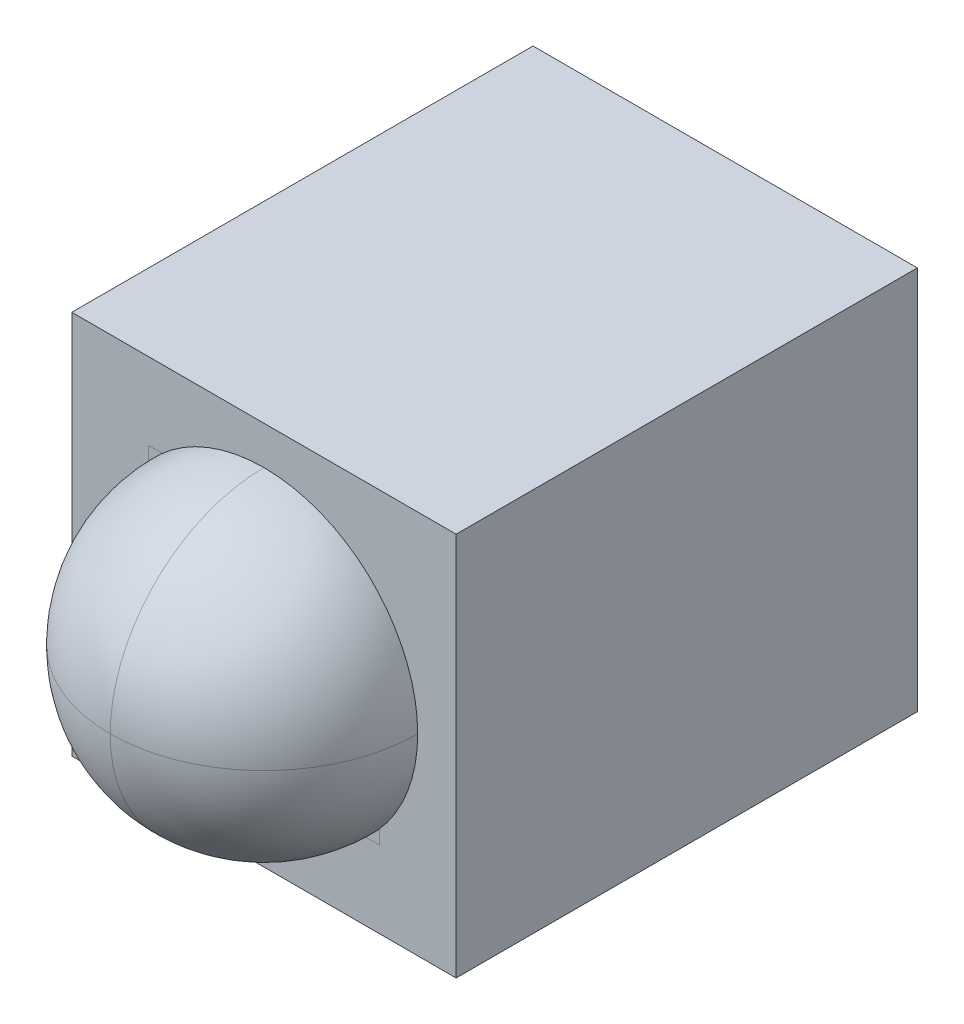
ISO-10303-21;
HEADER;
FILE_DESCRIPTION(('STEP AP214'),'2;1');
FILE_NAME('part.step','',(''),(''),'','','');
FILE_SCHEMA(('AUTOMOTIVE_DESIGN { 1 0 10303 214 1 1 1 1 }'));
ENDSEC;
DATA;
#1=APPLICATION_CONTEXT('core data for automotive mechanical design processes');
#2=APPLICATION_PROTOCOL_DEFINITION('international standard','automotive_design',2000,#1);
#3=PRODUCT_CONTEXT('',#1,'mechanical');
#4=PRODUCT('Part','Part','',(#3));
#5=PRODUCT_RELATED_PRODUCT_CATEGORY('part','',(#4));
#6=PRODUCT_DEFINITION_FORMATION('','',#4);
#7=PRODUCT_DEFINITION_CONTEXT('part definition',#1,'design');
#8=PRODUCT_DEFINITION('design','',#6,#7);
#9=PRODUCT_DEFINITION_SHAPE('','',#8);
#10=(LENGTH_UNIT() NAMED_UNIT(*) SI_UNIT(.MILLI.,.METRE.));
#11=(NAMED_UNIT(*) PLANE_ANGLE_UNIT() SI_UNIT($,.RADIAN.));
#12=(NAMED_UNIT(*) SI_UNIT($,.STERADIAN.) SOLID_ANGLE_UNIT());
#13=UNCERTAINTY_MEASURE_WITH_UNIT(LENGTH_MEASURE(1.E-05),#10,'distance_accuracy_value','');
#14=(GEOMETRIC_REPRESENTATION_CONTEXT(3) GLOBAL_UNCERTAINTY_ASSIGNED_CONTEXT((#13)) GLOBAL_UNIT_ASSIGNED_CONTEXT((#10,
#11,#12)) REPRESENTATION_CONTEXT('',''));
#15=CARTESIAN_POINT('',(0.,0.,0.));
#16=DIRECTION('',(0.,0.,1.));
#17=DIRECTION('',(1.,0.,0.));
#18=AXIS2_PLACEMENT_3D('',#15,#16,#17);
#19=CARTESIAN_POINT('',(0.,0.,3.));
#20=DIRECTION('',(0.,0.,1.));
#21=DIRECTION('',(1.,0.,0.));
#22=AXIS2_PLACEMENT_3D('',#19,#20,#21);
#23=PLANE('',#22);
#24=CARTESIAN_POINT('',(0.,0.,3.));
#25=DIRECTION('',(0.,0.,1.));
#26=DIRECTION('',(1.,0.,0.));
#27=AXIS2_PLACEMENT_3D('',#24,#25,#26);
#28=CIRCLE('',#27,1.);
#29=CARTESIAN_POINT('',(0.,-1.,3.));
#30=VERTEX_POINT('',#29);
#31=CARTESIAN_POINT('',(-1.,0.,3.));
#32=VERTEX_POINT('',#31);
#33=EDGE_CURVE('E54',#30,#32,#28,.F.);
#34=ORIENTED_EDGE('',*,*,#33,.T.);
#35=CARTESIAN_POINT('',(0.,0.,3.));
#36=DIRECTION('',(0.,0.,1.));
#37=DIRECTION('',(1.,0.,0.));
#38=AXIS2_PLACEMENT_3D('',#35,#36,#37);
#39=CIRCLE('',#38,1.);
#40=CARTESIAN_POINT('',(0.,1.,3.));
#41=VERTEX_POINT('',#40);
#42=EDGE_CURVE('E11',#32,#41,#39,.F.);
#43=ORIENTED_EDGE('',*,*,#42,.T.);
#44=CARTESIAN_POINT('',(0.,0.,3.));
#45=DIRECTION('',(0.,0.,1.));
#46=DIRECTION('',(1.,0.,0.));
#47=AXIS2_PLACEMENT_3D('',#44,#45,#46);
#48=CIRCLE('',#47,1.);
#49=CARTESIAN_POINT('',(1.,0.,3.));
#50=VERTEX_POINT('',#49);
#51=EDGE_CURVE('E140',#41,#50,#48,.F.);
#52=ORIENTED_EDGE('',*,*,#51,.T.);
#53=CARTESIAN_POINT('',(0.,0.,3.));
#54=DIRECTION('',(0.,0.,1.));
#55=DIRECTION('',(1.,0.,0.));
#56=AXIS2_PLACEMENT_3D('',#53,#54,#55);
#57=CIRCLE('',#56,1.);
#58=EDGE_CURVE('E143',#50,#30,#57,.F.);
#59=ORIENTED_EDGE('',*,*,#58,.T.);
#60=EDGE_LOOP('',(#34,#43,#52,#59));
#61=FACE_BOUND('',#60,.T.);
#62=DIRECTION('',(0.,-1.,0.));
#63=VECTOR('',#62,1.);
#64=CARTESIAN_POINT('',(-1.25,-1.25,3.));
#65=LINE('',#64,#63);
#66=CARTESIAN_POINT('',(-1.25,1.25,3.));
#67=VERTEX_POINT('',#66);
#68=CARTESIAN_POINT('',(-1.25,-1.25,3.));
#69=VERTEX_POINT('',#68);
#70=EDGE_CURVE('E164',#67,#69,#65,.T.);
#71=ORIENTED_EDGE('',*,*,#70,.T.);
#72=DIRECTION('',(1.,0.,0.));
#73=VECTOR('',#72,1.);
#74=CARTESIAN_POINT('',(1.25,-1.25,3.));
#75=LINE('',#74,#73);
#76=CARTESIAN_POINT('',(1.25,-1.25,3.));
#77=VERTEX_POINT('',#76);
#78=EDGE_CURVE('E176',#69,#77,#75,.T.);
#79=ORIENTED_EDGE('',*,*,#78,.T.);
#80=DIRECTION('',(0.,1.,0.));
#81=VECTOR('',#80,1.);
#82=CARTESIAN_POINT('',(1.25,-1.25,3.));
#83=LINE('',#82,#81);
#84=CARTESIAN_POINT('',(1.25,1.25,3.));
#85=VERTEX_POINT('',#84);
#86=EDGE_CURVE('E174',#77,#85,#83,.T.);
#87=ORIENTED_EDGE('',*,*,#86,.T.);
#88=DIRECTION('',(-1.,0.,0.));
#89=VECTOR('',#88,1.);
#90=CARTESIAN_POINT('',(1.25,1.25,3.));
#91=LINE('',#90,#89);
#92=EDGE_CURVE('E161',#85,#67,#91,.T.);
#93=ORIENTED_EDGE('',*,*,#92,.T.);
#94=EDGE_LOOP('',(#71,#79,#87,#93));
#95=FACE_BOUND('',#94,.T.);
#96=ADVANCED_FACE('F44',(#61,#95),#23,.T.);
#97=CARTESIAN_POINT('',(0.,0.,0.));
#98=DIRECTION('',(0.,0.,1.));
#99=DIRECTION('',(1.,0.,0.));
#100=AXIS2_PLACEMENT_3D('',#97,#98,#99);
#101=PLANE('',#100);
#102=DIRECTION('',(0.,-1.,0.));
#103=VECTOR('',#102,1.);
#104=CARTESIAN_POINT('',(-1.25,-1.25,0.));
#105=LINE('',#104,#103);
#106=CARTESIAN_POINT('',(-1.25,1.25,0.));
#107=VERTEX_POINT('',#106);
#108=CARTESIAN_POINT('',(-1.25,-1.25,0.));
#109=VERTEX_POINT('',#108);
#110=EDGE_CURVE('E169',#107,#109,#105,.T.);
#111=ORIENTED_EDGE('',*,*,#110,.F.);
#112=DIRECTION('',(-1.,0.,0.));
#113=VECTOR('',#112,1.);
#114=CARTESIAN_POINT('',(1.25,1.25,0.));
#115=LINE('',#114,#113);
#116=CARTESIAN_POINT('',(1.25,1.25,0.));
#117=VERTEX_POINT('',#116);
#118=EDGE_CURVE('E162',#117,#107,#115,.T.);
#119=ORIENTED_EDGE('',*,*,#118,.F.);
#120=DIRECTION('',(0.,1.,0.));
#121=VECTOR('',#120,1.);
#122=CARTESIAN_POINT('',(1.25,-1.25,0.));
#123=LINE('',#122,#121);
#124=CARTESIAN_POINT('',(1.25,-1.25,0.));
#125=VERTEX_POINT('',#124);
#126=EDGE_CURVE('E165',#125,#117,#123,.T.);
#127=ORIENTED_EDGE('',*,*,#126,.F.);
#128=DIRECTION('',(1.,0.,0.));
#129=VECTOR('',#128,1.);
#130=CARTESIAN_POINT('',(1.25,-1.25,0.));
#131=LINE('',#130,#129);
#132=EDGE_CURVE('E167',#109,#125,#131,.T.);
#133=ORIENTED_EDGE('',*,*,#132,.F.);
#134=EDGE_LOOP('',(#111,#119,#127,#133));
#135=FACE_BOUND('',#134,.T.);
#136=DIRECTION('',(0.,1.,0.));
#137=VECTOR('',#136,1.);
#138=CARTESIAN_POINT('',(0.75,-0.75,0.));
#139=LINE('',#138,#137);
#140=CARTESIAN_POINT('',(0.75,-0.75,0.));
#141=VERTEX_POINT('',#140);
#142=CARTESIAN_POINT('',(0.75,0.75,0.));
#143=VERTEX_POINT('',#142);
#144=EDGE_CURVE('E130',#141,#143,#139,.T.);
#145=ORIENTED_EDGE('',*,*,#144,.T.);
#146=DIRECTION('',(-1.,0.,0.));
#147=VECTOR('',#146,1.);
#148=CARTESIAN_POINT('',(-0.75,0.75,0.));
#149=LINE('',#148,#147);
#150=CARTESIAN_POINT('',(-0.75,0.75,0.));
#151=VERTEX_POINT('',#150);
#152=EDGE_CURVE('E196',#143,#151,#149,.T.);
#153=ORIENTED_EDGE('',*,*,#152,.T.);
#154=DIRECTION('',(0.,-1.,0.));
#155=VECTOR('',#154,1.);
#156=CARTESIAN_POINT('',(-0.75,-0.75,0.));
#157=LINE('',#156,#155);
#158=CARTESIAN_POINT('',(-0.75,-0.75,0.));
#159=VERTEX_POINT('',#158);
#160=EDGE_CURVE('E193',#151,#159,#157,.T.);
#161=ORIENTED_EDGE('',*,*,#160,.T.);
#162=DIRECTION('',(1.,0.,0.));
#163=VECTOR('',#162,1.);
#164=CARTESIAN_POINT('',(-0.75,-0.75,0.));
#165=LINE('',#164,#163);
#166=EDGE_CURVE('E189',#159,#141,#165,.T.);
#167=ORIENTED_EDGE('',*,*,#166,.T.);
#168=EDGE_LOOP('',(#145,#153,#161,#167));
#169=FACE_BOUND('',#168,.T.);
#170=ADVANCED_FACE('F218',(#135,#169),#101,.F.);
#171=CARTESIAN_POINT('',(-1.25,-1.25,3.));
#172=DIRECTION('',(1.,0.,0.));
#173=DIRECTION('',(0.,0.,-1.));
#174=AXIS2_PLACEMENT_3D('',#171,#172,#173);
#175=PLANE('',#174);
#176=ORIENTED_EDGE('',*,*,#110,.T.);
#177=DIRECTION('',(0.,0.,-1.));
#178=VECTOR('',#177,1.);
#179=CARTESIAN_POINT('',(-1.25,-1.25,3.));
#180=LINE('',#179,#178);
#181=EDGE_CURVE('E149',#69,#109,#180,.T.);
#182=ORIENTED_EDGE('',*,*,#181,.F.);
#183=ORIENTED_EDGE('',*,*,#70,.F.);
#184=DIRECTION('',(0.,0.,-1.));
#185=VECTOR('',#184,1.);
#186=CARTESIAN_POINT('',(-1.25,1.25,3.));
#187=LINE('',#186,#185);
#188=EDGE_CURVE('E158',#67,#107,#187,.T.);
#189=ORIENTED_EDGE('',*,*,#188,.T.);
#190=EDGE_LOOP('',(#176,#182,#183,#189));
#191=FACE_BOUND('',#190,.T.);
#192=ADVANCED_FACE('F237',(#191),#175,.F.);
#193=CARTESIAN_POINT('',(1.25,-1.25,3.));
#194=DIRECTION('',(0.,1.,0.));
#195=DIRECTION('',(-1.,0.,0.));
#196=AXIS2_PLACEMENT_3D('',#193,#194,#195);
#197=PLANE('',#196);
#198=ORIENTED_EDGE('',*,*,#132,.T.);
#199=DIRECTION('',(0.,0.,-1.));
#200=VECTOR('',#199,1.);
#201=CARTESIAN_POINT('',(1.25,-1.25,3.));
#202=LINE('',#201,#200);
#203=EDGE_CURVE('E152',#77,#125,#202,.T.);
#204=ORIENTED_EDGE('',*,*,#203,.F.);
#205=ORIENTED_EDGE('',*,*,#78,.F.);
#206=ORIENTED_EDGE('',*,*,#181,.T.);
#207=EDGE_LOOP('',(#198,#204,#205,#206));
#208=FACE_BOUND('',#207,.T.);
#209=ADVANCED_FACE('F251',(#208),#197,.F.);
#210=CARTESIAN_POINT('',(1.25,-1.25,3.));
#211=DIRECTION('',(-1.,0.,0.));
#212=DIRECTION('',(0.,0.,1.));
#213=AXIS2_PLACEMENT_3D('',#210,#211,#212);
#214=PLANE('',#213);
#215=ORIENTED_EDGE('',*,*,#126,.T.);
#216=DIRECTION('',(0.,0.,-1.));
#217=VECTOR('',#216,1.);
#218=CARTESIAN_POINT('',(1.25,1.25,3.));
#219=LINE('',#218,#217);
#220=EDGE_CURVE('E155',#85,#117,#219,.T.);
#221=ORIENTED_EDGE('',*,*,#220,.F.);
#222=ORIENTED_EDGE('',*,*,#86,.F.);
#223=ORIENTED_EDGE('',*,*,#203,.T.);
#224=EDGE_LOOP('',(#215,#221,#222,#223));
#225=FACE_BOUND('',#224,.T.);
#226=ADVANCED_FACE('F247',(#225),#214,.F.);
#227=CARTESIAN_POINT('',(1.25,1.25,3.));
#228=DIRECTION('',(0.,-1.,0.));
#229=DIRECTION('',(1.,0.,0.));
#230=AXIS2_PLACEMENT_3D('',#227,#228,#229);
#231=PLANE('',#230);
#232=ORIENTED_EDGE('',*,*,#118,.T.);
#233=ORIENTED_EDGE('',*,*,#188,.F.);
#234=ORIENTED_EDGE('',*,*,#92,.F.);
#235=ORIENTED_EDGE('',*,*,#220,.T.);
#236=EDGE_LOOP('',(#232,#233,#234,#235));
#237=FACE_BOUND('',#236,.T.);
#238=ADVANCED_FACE('F244',(#237),#231,.F.);
#239=CARTESIAN_POINT('',(0.75,-0.75,3.));
#240=DIRECTION('',(-1.,0.,0.));
#241=DIRECTION('',(0.,0.,1.));
#242=AXIS2_PLACEMENT_3D('',#239,#240,#241);
#243=PLANE('',#242);
#244=ORIENTED_EDGE('',*,*,#144,.F.);
#245=DIRECTION('',(0.,0.,-1.));
#246=VECTOR('',#245,1.);
#247=CARTESIAN_POINT('',(0.75,-0.75,3.));
#248=LINE('',#247,#246);
#249=CARTESIAN_POINT('',(0.75,-0.75,3.));
#250=VERTEX_POINT('',#249);
#251=EDGE_CURVE('E186',#250,#141,#248,.T.);
#252=ORIENTED_EDGE('',*,*,#251,.F.);
#253=DIRECTION('',(0.,1.,0.));
#254=VECTOR('',#253,1.);
#255=CARTESIAN_POINT('',(0.75,-0.75,3.));
#256=LINE('',#255,#254);
#257=CARTESIAN_POINT('',(0.750000000000001,0.75,3.));
#258=VERTEX_POINT('',#257);
#259=EDGE_CURVE('E192',#250,#258,#256,.T.);
#260=ORIENTED_EDGE('',*,*,#259,.T.);
#261=DIRECTION('',(0.,0.,-1.));
#262=VECTOR('',#261,1.);
#263=CARTESIAN_POINT('',(0.75,0.75,3.));
#264=LINE('',#263,#262);
#265=EDGE_CURVE('E172',#258,#143,#264,.T.);
#266=ORIENTED_EDGE('',*,*,#265,.T.);
#267=EDGE_LOOP('',(#244,#252,#260,#266));
#268=FACE_BOUND('',#267,.T.);
#269=ADVANCED_FACE('F212',(#268),#243,.T.);
#270=CARTESIAN_POINT('',(-0.75,0.75,3.));
#271=DIRECTION('',(0.,-1.,0.));
#272=DIRECTION('',(0.,0.,-1.));
#273=AXIS2_PLACEMENT_3D('',#270,#271,#272);
#274=PLANE('',#273);
#275=ORIENTED_EDGE('',*,*,#152,.F.);
#276=ORIENTED_EDGE('',*,*,#265,.F.);
#277=DIRECTION('',(-1.,0.,0.));
#278=VECTOR('',#277,1.);
#279=CARTESIAN_POINT('',(-0.75,0.75,3.));
#280=LINE('',#279,#278);
#281=CARTESIAN_POINT('',(-0.75,0.75,3.));
#282=VERTEX_POINT('',#281);
#283=EDGE_CURVE('E205',#258,#282,#280,.T.);
#284=ORIENTED_EDGE('',*,*,#283,.T.);
#285=DIRECTION('',(0.,0.,-1.));
#286=VECTOR('',#285,1.);
#287=CARTESIAN_POINT('',(-0.75,0.75,3.));
#288=LINE('',#287,#286);
#289=EDGE_CURVE('E182',#282,#151,#288,.T.);
#290=ORIENTED_EDGE('',*,*,#289,.T.);
#291=EDGE_LOOP('',(#275,#276,#284,#290));
#292=FACE_BOUND('',#291,.T.);
#293=ADVANCED_FACE('F214',(#292),#274,.T.);
#294=CARTESIAN_POINT('',(-0.75,-0.75,3.));
#295=DIRECTION('',(1.,0.,0.));
#296=DIRECTION('',(0.,0.,-1.));
#297=AXIS2_PLACEMENT_3D('',#294,#295,#296);
#298=PLANE('',#297);
#299=ORIENTED_EDGE('',*,*,#160,.F.);
#300=ORIENTED_EDGE('',*,*,#289,.F.);
#301=DIRECTION('',(0.,-1.,0.));
#302=VECTOR('',#301,1.);
#303=CARTESIAN_POINT('',(-0.75,-0.75,3.));
#304=LINE('',#303,#302);
#305=CARTESIAN_POINT('',(-0.75,-0.75,3.));
#306=VERTEX_POINT('',#305);
#307=EDGE_CURVE('E202',#282,#306,#304,.T.);
#308=ORIENTED_EDGE('',*,*,#307,.T.);
#309=DIRECTION('',(0.,0.,-1.));
#310=VECTOR('',#309,1.);
#311=CARTESIAN_POINT('',(-0.75,-0.75,3.));
#312=LINE('',#311,#310);
#313=EDGE_CURVE('E184',#306,#159,#312,.T.);
#314=ORIENTED_EDGE('',*,*,#313,.T.);
#315=EDGE_LOOP('',(#299,#300,#308,#314));
#316=FACE_BOUND('',#315,.T.);
#317=ADVANCED_FACE('F223',(#316),#298,.T.);
#318=CARTESIAN_POINT('',(-0.75,-0.75,3.));
#319=DIRECTION('',(0.,1.,0.));
#320=DIRECTION('',(0.,0.,1.));
#321=AXIS2_PLACEMENT_3D('',#318,#319,#320);
#322=PLANE('',#321);
#323=ORIENTED_EDGE('',*,*,#166,.F.);
#324=ORIENTED_EDGE('',*,*,#313,.F.);
#325=DIRECTION('',(1.,0.,0.));
#326=VECTOR('',#325,1.);
#327=CARTESIAN_POINT('',(-0.75,-0.75,3.));
#328=LINE('',#327,#326);
#329=EDGE_CURVE('E118',#306,#250,#328,.T.);
#330=ORIENTED_EDGE('',*,*,#329,.T.);
#331=ORIENTED_EDGE('',*,*,#251,.T.);
#332=EDGE_LOOP('',(#323,#324,#330,#331));
#333=FACE_BOUND('',#332,.T.);
#334=ADVANCED_FACE('F221',(#333),#322,.T.);
#335=CARTESIAN_POINT('',(0.,0.,3.));
#336=DIRECTION('',(0.,0.,1.));
#337=DIRECTION('',(1.,0.,0.));
#338=AXIS2_PLACEMENT_3D('',#335,#336,#337);
#339=PLANE('',#338);
#340=ORIENTED_EDGE('',*,*,#259,.F.);
#341=ORIENTED_EDGE('',*,*,#329,.F.);
#342=ORIENTED_EDGE('',*,*,#307,.F.);
#343=ORIENTED_EDGE('',*,*,#283,.F.);
#344=EDGE_LOOP('',(#340,#341,#342,#343));
#345=FACE_BOUND('',#344,.T.);
#346=ADVANCED_FACE('F224',(#345),#339,.F.);
#347=CARTESIAN_POINT('',(0.,0.,3.));
#348=DIRECTION('',(0.,0.,1.));
#349=DIRECTION('',(1.,0.,0.));
#350=AXIS2_PLACEMENT_3D('',#347,#348,#349);
#351=SPHERICAL_SURFACE('',#350,1.);
#352=CARTESIAN_POINT('',(0.,0.,3.));
#353=DIRECTION('',(0.,1.,0.));
#354=DIRECTION('',(0.,0.,1.));
#355=AXIS2_PLACEMENT_3D('',#352,#353,#354);
#356=CIRCLE('',#355,1.);
#357=CARTESIAN_POINT('',(0.,0.,4.));
#358=VERTEX_POINT('',#357);
#359=EDGE_CURVE('E48',#32,#358,#356,.T.);
#360=ORIENTED_EDGE('',*,*,#359,.F.);
#361=ORIENTED_EDGE('',*,*,#33,.F.);
#362=CARTESIAN_POINT('',(0.,0.,3.));
#363=DIRECTION('',(-1.,0.,0.));
#364=DIRECTION('',(0.,0.,1.));
#365=AXIS2_PLACEMENT_3D('',#362,#363,#364);
#366=CIRCLE('',#365,1.);
#367=EDGE_CURVE('E131',#358,#30,#366,.F.);
#368=ORIENTED_EDGE('',*,*,#367,.F.);
#369=EDGE_LOOP('',(#360,#361,#368));
#370=FACE_BOUND('',#369,.T.);
#371=ADVANCED_FACE('F46',(#370),#351,.T.);
#372=CARTESIAN_POINT('',(0.,0.,3.));
#373=DIRECTION('',(0.,0.,1.));
#374=DIRECTION('',(1.,0.,0.));
#375=AXIS2_PLACEMENT_3D('',#372,#373,#374);
#376=SPHERICAL_SURFACE('',#375,1.);
#377=ORIENTED_EDGE('',*,*,#42,.F.);
#378=ORIENTED_EDGE('',*,*,#359,.T.);
#379=CARTESIAN_POINT('',(0.,0.,3.));
#380=DIRECTION('',(1.,0.,0.));
#381=DIRECTION('',(0.,1.,0.));
#382=AXIS2_PLACEMENT_3D('',#379,#380,#381);
#383=CIRCLE('',#382,1.);
#384=EDGE_CURVE('E127',#41,#358,#383,.T.);
#385=ORIENTED_EDGE('',*,*,#384,.F.);
#386=EDGE_LOOP('',(#377,#378,#385));
#387=FACE_BOUND('',#386,.T.);
#388=ADVANCED_FACE('F125',(#387),#376,.T.);
#389=CARTESIAN_POINT('',(0.,0.,3.));
#390=DIRECTION('',(0.,0.,1.));
#391=DIRECTION('',(1.,0.,0.));
#392=AXIS2_PLACEMENT_3D('',#389,#390,#391);
#393=SPHERICAL_SURFACE('',#392,1.);
#394=ORIENTED_EDGE('',*,*,#367,.T.);
#395=ORIENTED_EDGE('',*,*,#58,.F.);
#396=CARTESIAN_POINT('',(0.,0.,3.));
#397=DIRECTION('',(0.,-1.,0.));
#398=DIRECTION('',(0.,0.,-1.));
#399=AXIS2_PLACEMENT_3D('',#396,#397,#398);
#400=CIRCLE('',#399,1.);
#401=EDGE_CURVE('E138',#358,#50,#400,.F.);
#402=ORIENTED_EDGE('',*,*,#401,.F.);
#403=EDGE_LOOP('',(#394,#395,#402));
#404=FACE_BOUND('',#403,.T.);
#405=ADVANCED_FACE('F142',(#404),#393,.T.);
#406=CARTESIAN_POINT('',(0.,0.,3.));
#407=DIRECTION('',(0.,0.,1.));
#408=DIRECTION('',(1.,0.,0.));
#409=AXIS2_PLACEMENT_3D('',#406,#407,#408);
#410=SPHERICAL_SURFACE('',#409,1.);
#411=ORIENTED_EDGE('',*,*,#51,.F.);
#412=ORIENTED_EDGE('',*,*,#384,.T.);
#413=ORIENTED_EDGE('',*,*,#401,.T.);
#414=EDGE_LOOP('',(#411,#412,#413));
#415=FACE_BOUND('',#414,.T.);
#416=ADVANCED_FACE('F137',(#415),#410,.T.);
#417=CLOSED_SHELL('',(#96,#170,#192,#209,#226,#238,#269,#293,#317,#334,#346,#371,#388,#405,#416));
#418=MANIFOLD_SOLID_BREP('B2',#417);
#419=ADVANCED_BREP_SHAPE_REPRESENTATION('',(#18,#418),#14);
#420=SHAPE_DEFINITION_REPRESENTATION(#9,#419);
ENDSEC;
END-ISO-10303-21;
